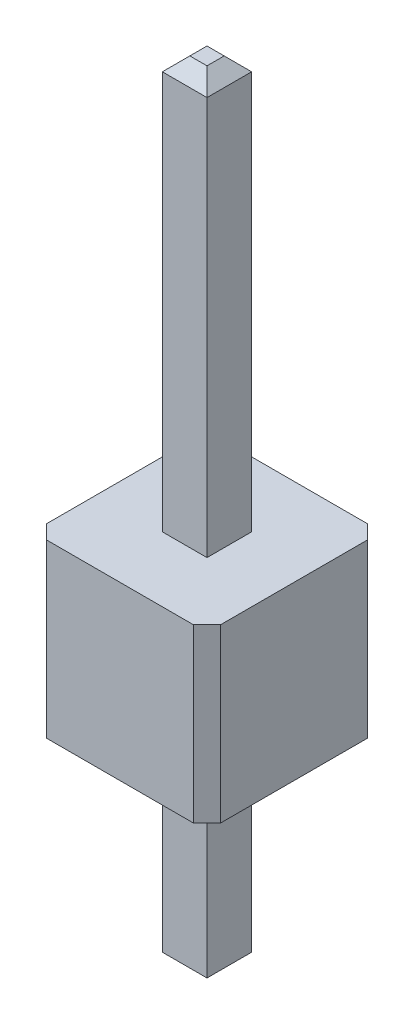
ISO-10303-21;
HEADER;
FILE_DESCRIPTION(('STEP AP214'),'2;1');
FILE_NAME('part.step','',(''),(''),'','','');
FILE_SCHEMA(('AUTOMOTIVE_DESIGN { 1 0 10303 214 1 1 1 1 }'));
ENDSEC;
DATA;
#1=APPLICATION_CONTEXT('core data for automotive mechanical design processes');
#2=APPLICATION_PROTOCOL_DEFINITION('international standard','automotive_design',2000,#1);
#3=PRODUCT_CONTEXT('',#1,'mechanical');
#4=PRODUCT('Part','Part','',(#3));
#5=PRODUCT_RELATED_PRODUCT_CATEGORY('part','',(#4));
#6=PRODUCT_DEFINITION_FORMATION('','',#4);
#7=PRODUCT_DEFINITION_CONTEXT('part definition',#1,'design');
#8=PRODUCT_DEFINITION('design','',#6,#7);
#9=PRODUCT_DEFINITION_SHAPE('','',#8);
#10=(LENGTH_UNIT() NAMED_UNIT(*) SI_UNIT(.MILLI.,.METRE.));
#11=(NAMED_UNIT(*) PLANE_ANGLE_UNIT() SI_UNIT($,.RADIAN.));
#12=(NAMED_UNIT(*) SI_UNIT($,.STERADIAN.) SOLID_ANGLE_UNIT());
#13=UNCERTAINTY_MEASURE_WITH_UNIT(LENGTH_MEASURE(1.E-05),#10,'distance_accuracy_value','');
#14=(GEOMETRIC_REPRESENTATION_CONTEXT(3) GLOBAL_UNCERTAINTY_ASSIGNED_CONTEXT((#13)) GLOBAL_UNIT_ASSIGNED_CONTEXT((#10,
#11,#12)) REPRESENTATION_CONTEXT('',''));
#15=CARTESIAN_POINT('',(0.,0.,0.));
#16=DIRECTION('',(0.,0.,1.));
#17=DIRECTION('',(1.,0.,0.));
#18=AXIS2_PLACEMENT_3D('',#15,#16,#17);
#19=CARTESIAN_POINT('',(1.27,2.5,1.27));
#20=DIRECTION('',(-1.,0.,0.));
#21=DIRECTION('',(0.,0.,1.));
#22=AXIS2_PLACEMENT_3D('',#19,#20,#21);
#23=PLANE('',#22);
#24=DIRECTION('',(0.,0.,-1.));
#25=VECTOR('',#24,1.);
#26=CARTESIAN_POINT('',(1.27,0.,1.27));
#27=LINE('',#26,#25);
#28=CARTESIAN_POINT('',(1.27,0.,1.07));
#29=VERTEX_POINT('',#28);
#30=CARTESIAN_POINT('',(1.27,0.,-1.07));
#31=VERTEX_POINT('',#30);
#32=EDGE_CURVE('E208',#29,#31,#27,.T.);
#33=ORIENTED_EDGE('',*,*,#32,.T.);
#34=DIRECTION('',(0.,1.,0.));
#35=VECTOR('',#34,1.);
#36=CARTESIAN_POINT('',(1.27,2.5,-1.07));
#37=LINE('',#36,#35);
#38=CARTESIAN_POINT('',(1.27,2.5,-1.07));
#39=VERTEX_POINT('',#38);
#40=EDGE_CURVE('E298',#31,#39,#37,.T.);
#41=ORIENTED_EDGE('',*,*,#40,.T.);
#42=DIRECTION('',(0.,0.,-1.));
#43=VECTOR('',#42,1.);
#44=CARTESIAN_POINT('',(1.27,2.5,1.27));
#45=LINE('',#44,#43);
#46=CARTESIAN_POINT('',(1.27,2.5,1.07));
#47=VERTEX_POINT('',#46);
#48=EDGE_CURVE('E209',#47,#39,#45,.T.);
#49=ORIENTED_EDGE('',*,*,#48,.F.);
#50=DIRECTION('',(0.,-1.,0.));
#51=VECTOR('',#50,1.);
#52=CARTESIAN_POINT('',(1.27,2.5,1.07));
#53=LINE('',#52,#51);
#54=EDGE_CURVE('E294',#47,#29,#53,.T.);
#55=ORIENTED_EDGE('',*,*,#54,.T.);
#56=EDGE_LOOP('',(#33,#41,#49,#55));
#57=FACE_BOUND('',#56,.T.);
#58=ADVANCED_FACE('F39',(#57),#23,.F.);
#59=CARTESIAN_POINT('',(-1.27,2.5,-1.27));
#60=DIRECTION('',(0.,0.,1.));
#61=DIRECTION('',(1.,0.,0.));
#62=AXIS2_PLACEMENT_3D('',#59,#60,#61);
#63=PLANE('',#62);
#64=DIRECTION('',(-1.,0.,0.));
#65=VECTOR('',#64,1.);
#66=CARTESIAN_POINT('',(-1.27,0.,-1.27));
#67=LINE('',#66,#65);
#68=CARTESIAN_POINT('',(1.07,0.,-1.27));
#69=VERTEX_POINT('',#68);
#70=CARTESIAN_POINT('',(-1.07,0.,-1.27));
#71=VERTEX_POINT('',#70);
#72=EDGE_CURVE('E230',#69,#71,#67,.T.);
#73=ORIENTED_EDGE('',*,*,#72,.T.);
#74=DIRECTION('',(0.,1.,0.));
#75=VECTOR('',#74,1.);
#76=CARTESIAN_POINT('',(-1.07,2.5,-1.27));
#77=LINE('',#76,#75);
#78=CARTESIAN_POINT('',(-1.07,2.5,-1.27));
#79=VERTEX_POINT('',#78);
#80=EDGE_CURVE('E279',#71,#79,#77,.T.);
#81=ORIENTED_EDGE('',*,*,#80,.T.);
#82=DIRECTION('',(-1.,0.,0.));
#83=VECTOR('',#82,1.);
#84=CARTESIAN_POINT('',(-1.27,2.5,-1.27));
#85=LINE('',#84,#83);
#86=CARTESIAN_POINT('',(1.07,2.5,-1.27));
#87=VERTEX_POINT('',#86);
#88=EDGE_CURVE('E213',#87,#79,#85,.T.);
#89=ORIENTED_EDGE('',*,*,#88,.F.);
#90=DIRECTION('',(0.,-1.,0.));
#91=VECTOR('',#90,1.);
#92=CARTESIAN_POINT('',(1.07,2.5,-1.27));
#93=LINE('',#92,#91);
#94=EDGE_CURVE('E275',#87,#69,#93,.T.);
#95=ORIENTED_EDGE('',*,*,#94,.T.);
#96=EDGE_LOOP('',(#73,#81,#89,#95));
#97=FACE_BOUND('',#96,.T.);
#98=ADVANCED_FACE('F422',(#97),#63,.F.);
#99=CARTESIAN_POINT('',(-1.27,2.5,1.27));
#100=DIRECTION('',(1.,0.,0.));
#101=DIRECTION('',(0.,0.,-1.));
#102=AXIS2_PLACEMENT_3D('',#99,#100,#101);
#103=PLANE('',#102);
#104=DIRECTION('',(0.,0.,1.));
#105=VECTOR('',#104,1.);
#106=CARTESIAN_POINT('',(-1.27,2.5,1.27));
#107=LINE('',#106,#105);
#108=CARTESIAN_POINT('',(-1.27,2.5,-1.07));
#109=VERTEX_POINT('',#108);
#110=CARTESIAN_POINT('',(-1.27,2.5,1.07));
#111=VERTEX_POINT('',#110);
#112=EDGE_CURVE('E218',#109,#111,#107,.T.);
#113=ORIENTED_EDGE('',*,*,#112,.F.);
#114=DIRECTION('',(0.,-1.,0.));
#115=VECTOR('',#114,1.);
#116=CARTESIAN_POINT('',(-1.27,2.5,-1.07));
#117=LINE('',#116,#115);
#118=CARTESIAN_POINT('',(-1.27,0.,-1.07));
#119=VERTEX_POINT('',#118);
#120=EDGE_CURVE('E259',#109,#119,#117,.T.);
#121=ORIENTED_EDGE('',*,*,#120,.T.);
#122=DIRECTION('',(0.,0.,1.));
#123=VECTOR('',#122,1.);
#124=CARTESIAN_POINT('',(-1.27,0.,1.27));
#125=LINE('',#124,#123);
#126=CARTESIAN_POINT('',(-1.27,0.,1.07));
#127=VERTEX_POINT('',#126);
#128=EDGE_CURVE('E234',#119,#127,#125,.T.);
#129=ORIENTED_EDGE('',*,*,#128,.T.);
#130=DIRECTION('',(0.,1.,0.));
#131=VECTOR('',#130,1.);
#132=CARTESIAN_POINT('',(-1.27,2.5,1.07));
#133=LINE('',#132,#131);
#134=EDGE_CURVE('E256',#127,#111,#133,.T.);
#135=ORIENTED_EDGE('',*,*,#134,.T.);
#136=EDGE_LOOP('',(#113,#121,#129,#135));
#137=FACE_BOUND('',#136,.T.);
#138=ADVANCED_FACE('F428',(#137),#103,.F.);
#139=CARTESIAN_POINT('',(-1.27,2.5,1.27));
#140=DIRECTION('',(0.,0.,-1.));
#141=DIRECTION('',(-1.,0.,0.));
#142=AXIS2_PLACEMENT_3D('',#139,#140,#141);
#143=PLANE('',#142);
#144=DIRECTION('',(1.,0.,0.));
#145=VECTOR('',#144,1.);
#146=CARTESIAN_POINT('',(-1.27,2.5,1.27));
#147=LINE('',#146,#145);
#148=CARTESIAN_POINT('',(-1.07,2.5,1.27));
#149=VERTEX_POINT('',#148);
#150=CARTESIAN_POINT('',(1.07,2.5,1.27));
#151=VERTEX_POINT('',#150);
#152=EDGE_CURVE('E222',#149,#151,#147,.T.);
#153=ORIENTED_EDGE('',*,*,#152,.F.);
#154=DIRECTION('',(0.,-1.,0.));
#155=VECTOR('',#154,1.);
#156=CARTESIAN_POINT('',(-1.07,2.5,1.27));
#157=LINE('',#156,#155);
#158=CARTESIAN_POINT('',(-1.07,0.,1.27));
#159=VERTEX_POINT('',#158);
#160=EDGE_CURVE('E304',#149,#159,#157,.T.);
#161=ORIENTED_EDGE('',*,*,#160,.T.);
#162=DIRECTION('',(1.,0.,0.));
#163=VECTOR('',#162,1.);
#164=CARTESIAN_POINT('',(-1.27,0.,1.27));
#165=LINE('',#164,#163);
#166=CARTESIAN_POINT('',(1.07,0.,1.27));
#167=VERTEX_POINT('',#166);
#168=EDGE_CURVE('E214',#159,#167,#165,.T.);
#169=ORIENTED_EDGE('',*,*,#168,.T.);
#170=DIRECTION('',(0.,1.,0.));
#171=VECTOR('',#170,1.);
#172=CARTESIAN_POINT('',(1.07,2.5,1.27));
#173=LINE('',#172,#171);
#174=EDGE_CURVE('E301',#167,#151,#173,.T.);
#175=ORIENTED_EDGE('',*,*,#174,.T.);
#176=EDGE_LOOP('',(#153,#161,#169,#175));
#177=FACE_BOUND('',#176,.T.);
#178=ADVANCED_FACE('F525',(#177),#143,.F.);
#179=CARTESIAN_POINT('',(0.,2.5,0.));
#180=DIRECTION('',(0.,-1.,0.));
#181=DIRECTION('',(0.,0.,-1.));
#182=AXIS2_PLACEMENT_3D('',#179,#180,#181);
#183=PLANE('',#182);
#184=DIRECTION('',(1.,0.,0.));
#185=VECTOR('',#184,1.);
#186=CARTESIAN_POINT('',(0.,2.5,-0.325));
#187=LINE('',#186,#185);
#188=CARTESIAN_POINT('',(-0.325,2.5,-0.325));
#189=VERTEX_POINT('',#188);
#190=CARTESIAN_POINT('',(0.325,2.5,-0.325));
#191=VERTEX_POINT('',#190);
#192=EDGE_CURVE('E177',#189,#191,#187,.T.);
#193=ORIENTED_EDGE('',*,*,#192,.T.);
#194=DIRECTION('',(0.,0.,1.));
#195=VECTOR('',#194,1.);
#196=CARTESIAN_POINT('',(0.325,2.5,0.));
#197=LINE('',#196,#195);
#198=CARTESIAN_POINT('',(0.325,2.5,0.325));
#199=VERTEX_POINT('',#198);
#200=EDGE_CURVE('E202',#191,#199,#197,.T.);
#201=ORIENTED_EDGE('',*,*,#200,.T.);
#202=DIRECTION('',(-1.,0.,0.));
#203=VECTOR('',#202,1.);
#204=CARTESIAN_POINT('',(0.,2.5,0.325));
#205=LINE('',#204,#203);
#206=CARTESIAN_POINT('',(-0.325,2.5,0.325));
#207=VERTEX_POINT('',#206);
#208=EDGE_CURVE('E198',#199,#207,#205,.T.);
#209=ORIENTED_EDGE('',*,*,#208,.T.);
#210=DIRECTION('',(0.,0.,-1.));
#211=VECTOR('',#210,1.);
#212=CARTESIAN_POINT('',(-0.325,2.5,0.));
#213=LINE('',#212,#211);
#214=EDGE_CURVE('E186',#207,#189,#213,.T.);
#215=ORIENTED_EDGE('',*,*,#214,.T.);
#216=EDGE_LOOP('',(#193,#201,#209,#215));
#217=FACE_BOUND('',#216,.T.);
#218=ORIENTED_EDGE('',*,*,#88,.T.);
#219=DIRECTION('',(0.707106781186548,0.,-0.707106781186548));
#220=VECTOR('',#219,1.);
#221=CARTESIAN_POINT('',(-1.27,2.5,-1.07));
#222=LINE('',#221,#220);
#223=EDGE_CURVE('E291',#79,#109,#222,.F.);
#224=ORIENTED_EDGE('',*,*,#223,.T.);
#225=ORIENTED_EDGE('',*,*,#112,.T.);
#226=DIRECTION('',(-0.707106781186548,0.,-0.707106781186548));
#227=VECTOR('',#226,1.);
#228=CARTESIAN_POINT('',(-1.07,2.5,1.27));
#229=LINE('',#228,#227);
#230=EDGE_CURVE('E285',#111,#149,#229,.F.);
#231=ORIENTED_EDGE('',*,*,#230,.T.);
#232=ORIENTED_EDGE('',*,*,#152,.T.);
#233=DIRECTION('',(-0.707106781186548,0.,0.707106781186548));
#234=VECTOR('',#233,1.);
#235=CARTESIAN_POINT('',(1.27,2.5,1.07));
#236=LINE('',#235,#234);
#237=EDGE_CURVE('E282',#151,#47,#236,.F.);
#238=ORIENTED_EDGE('',*,*,#237,.T.);
#239=ORIENTED_EDGE('',*,*,#48,.T.);
#240=DIRECTION('',(0.707106781186544,0.,0.707106781186551));
#241=VECTOR('',#240,1.);
#242=CARTESIAN_POINT('',(1.07,2.5,-1.27));
#243=LINE('',#242,#241);
#244=EDGE_CURVE('E288',#39,#87,#243,.F.);
#245=ORIENTED_EDGE('',*,*,#244,.T.);
#246=EDGE_LOOP('',(#218,#224,#225,#231,#232,#238,#239,#245));
#247=FACE_BOUND('',#246,.T.);
#248=ADVANCED_FACE('F196',(#217,#247),#183,.F.);
#249=CARTESIAN_POINT('',(0.,0.,0.));
#250=DIRECTION('',(0.,-1.,0.));
#251=DIRECTION('',(0.,0.,-1.));
#252=AXIS2_PLACEMENT_3D('',#249,#250,#251);
#253=PLANE('',#252);
#254=DIRECTION('',(0.,0.,1.));
#255=VECTOR('',#254,1.);
#256=CARTESIAN_POINT('',(0.325,0.,0.));
#257=LINE('',#256,#255);
#258=CARTESIAN_POINT('',(0.325,0.,-0.325));
#259=VERTEX_POINT('',#258);
#260=CARTESIAN_POINT('',(0.325,0.,0.325));
#261=VERTEX_POINT('',#260);
#262=EDGE_CURVE('E252',#259,#261,#257,.T.);
#263=ORIENTED_EDGE('',*,*,#262,.F.);
#264=DIRECTION('',(1.,0.,0.));
#265=VECTOR('',#264,1.);
#266=CARTESIAN_POINT('',(0.,0.,-0.325));
#267=LINE('',#266,#265);
#268=CARTESIAN_POINT('',(-0.325,0.,-0.325));
#269=VERTEX_POINT('',#268);
#270=EDGE_CURVE('E226',#269,#259,#267,.T.);
#271=ORIENTED_EDGE('',*,*,#270,.F.);
#272=DIRECTION('',(0.,0.,-1.));
#273=VECTOR('',#272,1.);
#274=CARTESIAN_POINT('',(-0.325,0.,0.));
#275=LINE('',#274,#273);
#276=CARTESIAN_POINT('',(-0.325,0.,0.325));
#277=VERTEX_POINT('',#276);
#278=EDGE_CURVE('E244',#277,#269,#275,.T.);
#279=ORIENTED_EDGE('',*,*,#278,.F.);
#280=DIRECTION('',(-1.,0.,0.));
#281=VECTOR('',#280,1.);
#282=CARTESIAN_POINT('',(0.,0.,0.325));
#283=LINE('',#282,#281);
#284=EDGE_CURVE('E248',#261,#277,#283,.T.);
#285=ORIENTED_EDGE('',*,*,#284,.F.);
#286=EDGE_LOOP('',(#263,#271,#279,#285));
#287=FACE_BOUND('',#286,.T.);
#288=ORIENTED_EDGE('',*,*,#128,.F.);
#289=DIRECTION('',(-0.707106781186548,0.,0.707106781186548));
#290=VECTOR('',#289,1.);
#291=CARTESIAN_POINT('',(-1.17,0.,-1.17));
#292=LINE('',#291,#290);
#293=EDGE_CURVE('E272',#119,#71,#292,.F.);
#294=ORIENTED_EDGE('',*,*,#293,.T.);
#295=ORIENTED_EDGE('',*,*,#72,.F.);
#296=DIRECTION('',(-0.707106781186544,0.,-0.707106781186551));
#297=VECTOR('',#296,1.);
#298=CARTESIAN_POINT('',(1.17,0.,-1.16999999999999));
#299=LINE('',#298,#297);
#300=EDGE_CURVE('E269',#69,#31,#299,.F.);
#301=ORIENTED_EDGE('',*,*,#300,.T.);
#302=ORIENTED_EDGE('',*,*,#32,.F.);
#303=DIRECTION('',(0.707106781186548,0.,-0.707106781186548));
#304=VECTOR('',#303,1.);
#305=CARTESIAN_POINT('',(1.17,0.,1.17));
#306=LINE('',#305,#304);
#307=EDGE_CURVE('E263',#29,#167,#306,.F.);
#308=ORIENTED_EDGE('',*,*,#307,.T.);
#309=ORIENTED_EDGE('',*,*,#168,.F.);
#310=DIRECTION('',(0.707106781186548,0.,0.707106781186548));
#311=VECTOR('',#310,1.);
#312=CARTESIAN_POINT('',(-1.17,0.,1.17));
#313=LINE('',#312,#311);
#314=EDGE_CURVE('E266',#159,#127,#313,.F.);
#315=ORIENTED_EDGE('',*,*,#314,.T.);
#316=EDGE_LOOP('',(#288,#294,#295,#301,#302,#308,#309,#315));
#317=FACE_BOUND('',#316,.T.);
#318=ADVANCED_FACE('F508',(#287,#317),#253,.T.);
#319=CARTESIAN_POINT('',(0.,-3.,0.));
#320=DIRECTION('',(0.,-1.,0.));
#321=DIRECTION('',(0.,0.,-1.));
#322=AXIS2_PLACEMENT_3D('',#319,#320,#321);
#323=PLANE('',#322);
#324=DIRECTION('',(0.,0.,1.));
#325=VECTOR('',#324,1.);
#326=CARTESIAN_POINT('',(0.125,-3.,0.));
#327=LINE('',#326,#325);
#328=CARTESIAN_POINT('',(0.125,-3.,-0.125));
#329=VERTEX_POINT('',#328);
#330=CARTESIAN_POINT('',(0.125,-3.,0.124999999999999));
#331=VERTEX_POINT('',#330);
#332=EDGE_CURVE('E312',#329,#331,#327,.T.);
#333=ORIENTED_EDGE('',*,*,#332,.T.);
#334=DIRECTION('',(-1.,0.,0.));
#335=VECTOR('',#334,1.);
#336=CARTESIAN_POINT('',(0.,-3.,0.124999999999999));
#337=LINE('',#336,#335);
#338=CARTESIAN_POINT('',(-0.124999999999999,-3.,0.124999999999999));
#339=VERTEX_POINT('',#338);
#340=EDGE_CURVE('E321',#331,#339,#337,.T.);
#341=ORIENTED_EDGE('',*,*,#340,.T.);
#342=DIRECTION('',(0.,0.,-1.));
#343=VECTOR('',#342,1.);
#344=CARTESIAN_POINT('',(-0.124999999999999,-3.,0.));
#345=LINE('',#344,#343);
#346=CARTESIAN_POINT('',(-0.124999999999999,-3.,-0.125));
#347=VERTEX_POINT('',#346);
#348=EDGE_CURVE('E318',#339,#347,#345,.T.);
#349=ORIENTED_EDGE('',*,*,#348,.T.);
#350=DIRECTION('',(1.,0.,0.));
#351=VECTOR('',#350,1.);
#352=CARTESIAN_POINT('',(0.,-3.,-0.125));
#353=LINE('',#352,#351);
#354=EDGE_CURVE('E315',#347,#329,#353,.T.);
#355=ORIENTED_EDGE('',*,*,#354,.T.);
#356=EDGE_LOOP('',(#333,#341,#349,#355));
#357=FACE_BOUND('',#356,.T.);
#358=ADVANCED_FACE('F513',(#357),#323,.T.);
#359=CARTESIAN_POINT('',(-0.325,-3.,-0.325));
#360=DIRECTION('',(0.,0.,-1.));
#361=DIRECTION('',(-1.,0.,0.));
#362=AXIS2_PLACEMENT_3D('',#359,#360,#361);
#363=PLANE('',#362);
#364=DIRECTION('',(0.,1.,0.));
#365=VECTOR('',#364,1.);
#366=CARTESIAN_POINT('',(0.325,-3.,-0.325));
#367=LINE('',#366,#365);
#368=CARTESIAN_POINT('',(0.325,-2.8,-0.325));
#369=VERTEX_POINT('',#368);
#370=EDGE_CURVE('E193',#369,#259,#367,.T.);
#371=ORIENTED_EDGE('',*,*,#370,.F.);
#372=DIRECTION('',(-1.,0.,0.));
#373=VECTOR('',#372,1.);
#374=CARTESIAN_POINT('',(-0.325,-2.8,-0.325));
#375=LINE('',#374,#373);
#376=CARTESIAN_POINT('',(-0.325,-2.8,-0.325));
#377=VERTEX_POINT('',#376);
#378=EDGE_CURVE('E328',#369,#377,#375,.T.);
#379=ORIENTED_EDGE('',*,*,#378,.T.);
#380=DIRECTION('',(0.,1.,0.));
#381=VECTOR('',#380,1.);
#382=CARTESIAN_POINT('',(-0.325,-3.,-0.325));
#383=LINE('',#382,#381);
#384=EDGE_CURVE('E192',#377,#269,#383,.T.);
#385=ORIENTED_EDGE('',*,*,#384,.T.);
#386=ORIENTED_EDGE('',*,*,#270,.T.);
#387=EDGE_LOOP('',(#371,#379,#385,#386));
#388=FACE_BOUND('',#387,.T.);
#389=ADVANCED_FACE('F419',(#388),#363,.T.);
#390=CARTESIAN_POINT('',(-0.325,-3.,0.325));
#391=DIRECTION('',(-1.,0.,0.));
#392=DIRECTION('',(0.,0.,1.));
#393=AXIS2_PLACEMENT_3D('',#390,#391,#392);
#394=PLANE('',#393);
#395=ORIENTED_EDGE('',*,*,#384,.F.);
#396=DIRECTION('',(0.,0.,1.));
#397=VECTOR('',#396,1.);
#398=CARTESIAN_POINT('',(-0.325,-2.8,0.325));
#399=LINE('',#398,#397);
#400=CARTESIAN_POINT('',(-0.325,-2.8,0.325));
#401=VERTEX_POINT('',#400);
#402=EDGE_CURVE('E325',#377,#401,#399,.T.);
#403=ORIENTED_EDGE('',*,*,#402,.T.);
#404=DIRECTION('',(0.,1.,0.));
#405=VECTOR('',#404,1.);
#406=CARTESIAN_POINT('',(-0.325,-3.,0.325));
#407=LINE('',#406,#405);
#408=EDGE_CURVE('E401',#401,#277,#407,.T.);
#409=ORIENTED_EDGE('',*,*,#408,.T.);
#410=ORIENTED_EDGE('',*,*,#278,.T.);
#411=EDGE_LOOP('',(#395,#403,#409,#410));
#412=FACE_BOUND('',#411,.T.);
#413=ADVANCED_FACE('F564',(#412),#394,.T.);
#414=CARTESIAN_POINT('',(-0.325,-3.,0.325));
#415=DIRECTION('',(0.,0.,1.));
#416=DIRECTION('',(1.,0.,0.));
#417=AXIS2_PLACEMENT_3D('',#414,#415,#416);
#418=PLANE('',#417);
#419=ORIENTED_EDGE('',*,*,#408,.F.);
#420=DIRECTION('',(1.,0.,0.));
#421=VECTOR('',#420,1.);
#422=CARTESIAN_POINT('',(-0.325,-2.8,0.325));
#423=LINE('',#422,#421);
#424=CARTESIAN_POINT('',(0.325,-2.8,0.325));
#425=VERTEX_POINT('',#424);
#426=EDGE_CURVE('E308',#401,#425,#423,.T.);
#427=ORIENTED_EDGE('',*,*,#426,.T.);
#428=DIRECTION('',(0.,1.,0.));
#429=VECTOR('',#428,1.);
#430=CARTESIAN_POINT('',(0.325,-3.,0.325));
#431=LINE('',#430,#429);
#432=EDGE_CURVE('E187',#425,#261,#431,.T.);
#433=ORIENTED_EDGE('',*,*,#432,.T.);
#434=ORIENTED_EDGE('',*,*,#284,.T.);
#435=EDGE_LOOP('',(#419,#427,#433,#434));
#436=FACE_BOUND('',#435,.T.);
#437=ADVANCED_FACE('F560',(#436),#418,.T.);
#438=CARTESIAN_POINT('',(0.325,-3.,0.325));
#439=DIRECTION('',(1.,0.,0.));
#440=DIRECTION('',(0.,0.,-1.));
#441=AXIS2_PLACEMENT_3D('',#438,#439,#440);
#442=PLANE('',#441);
#443=ORIENTED_EDGE('',*,*,#432,.F.);
#444=DIRECTION('',(0.,0.,-1.));
#445=VECTOR('',#444,1.);
#446=CARTESIAN_POINT('',(0.325,-2.8,0.325));
#447=LINE('',#446,#445);
#448=EDGE_CURVE('E331',#425,#369,#447,.T.);
#449=ORIENTED_EDGE('',*,*,#448,.T.);
#450=ORIENTED_EDGE('',*,*,#370,.T.);
#451=ORIENTED_EDGE('',*,*,#262,.T.);
#452=EDGE_LOOP('',(#443,#449,#450,#451));
#453=FACE_BOUND('',#452,.T.);
#454=ADVANCED_FACE('F558',(#453),#442,.T.);
#455=CARTESIAN_POINT('',(0.325,8.3,-0.325));
#456=VERTEX_POINT('',#455);
#457=EDGE_CURVE('E180',#191,#456,#367,.T.);
#458=ORIENTED_EDGE('',*,*,#457,.T.);
#459=DIRECTION('',(0.,0.,1.));
#460=VECTOR('',#459,1.);
#461=CARTESIAN_POINT('',(0.325,8.3,0.325));
#462=LINE('',#461,#460);
#463=CARTESIAN_POINT('',(0.325,8.3,0.325));
#464=VERTEX_POINT('',#463);
#465=EDGE_CURVE('E11',#456,#464,#462,.T.);
#466=ORIENTED_EDGE('',*,*,#465,.T.);
#467=EDGE_CURVE('E396',#199,#464,#431,.T.);
#468=ORIENTED_EDGE('',*,*,#467,.F.);
#469=ORIENTED_EDGE('',*,*,#200,.F.);
#470=EDGE_LOOP('',(#458,#466,#468,#469));
#471=FACE_BOUND('',#470,.T.);
#472=ADVANCED_FACE('F395',(#471),#442,.T.);
#473=ORIENTED_EDGE('',*,*,#467,.T.);
#474=DIRECTION('',(-1.,0.,0.));
#475=VECTOR('',#474,1.);
#476=CARTESIAN_POINT('',(-0.325,8.3,0.325));
#477=LINE('',#476,#475);
#478=CARTESIAN_POINT('',(-0.325,8.3,0.325));
#479=VERTEX_POINT('',#478);
#480=EDGE_CURVE('E347',#464,#479,#477,.T.);
#481=ORIENTED_EDGE('',*,*,#480,.T.);
#482=EDGE_CURVE('E590',#207,#479,#407,.T.);
#483=ORIENTED_EDGE('',*,*,#482,.F.);
#484=ORIENTED_EDGE('',*,*,#208,.F.);
#485=EDGE_LOOP('',(#473,#481,#483,#484));
#486=FACE_BOUND('',#485,.T.);
#487=ADVANCED_FACE('F399',(#486),#418,.T.);
#488=ORIENTED_EDGE('',*,*,#482,.T.);
#489=DIRECTION('',(0.,0.,-1.));
#490=VECTOR('',#489,1.);
#491=CARTESIAN_POINT('',(-0.325,8.3,-0.325));
#492=LINE('',#491,#490);
#493=CARTESIAN_POINT('',(-0.325,8.3,-0.325));
#494=VERTEX_POINT('',#493);
#495=EDGE_CURVE('E64',#479,#494,#492,.T.);
#496=ORIENTED_EDGE('',*,*,#495,.T.);
#497=EDGE_CURVE('E179',#189,#494,#383,.T.);
#498=ORIENTED_EDGE('',*,*,#497,.F.);
#499=ORIENTED_EDGE('',*,*,#214,.F.);
#500=EDGE_LOOP('',(#488,#496,#498,#499));
#501=FACE_BOUND('',#500,.T.);
#502=ADVANCED_FACE('F189',(#501),#394,.T.);
#503=ORIENTED_EDGE('',*,*,#497,.T.);
#504=DIRECTION('',(1.,0.,0.));
#505=VECTOR('',#504,1.);
#506=CARTESIAN_POINT('',(0.325,8.3,-0.325));
#507=LINE('',#506,#505);
#508=EDGE_CURVE('E49',#494,#456,#507,.T.);
#509=ORIENTED_EDGE('',*,*,#508,.T.);
#510=ORIENTED_EDGE('',*,*,#457,.F.);
#511=ORIENTED_EDGE('',*,*,#192,.F.);
#512=EDGE_LOOP('',(#503,#509,#510,#511));
#513=FACE_BOUND('',#512,.T.);
#514=ADVANCED_FACE('F178',(#513),#363,.T.);
#515=CARTESIAN_POINT('',(0.,8.5,0.));
#516=DIRECTION('',(0.,-1.,0.));
#517=DIRECTION('',(0.,0.,-1.));
#518=AXIS2_PLACEMENT_3D('',#515,#516,#517);
#519=PLANE('',#518);
#520=DIRECTION('',(0.,0.,1.));
#521=VECTOR('',#520,1.);
#522=CARTESIAN_POINT('',(-0.124999999999998,8.5,0.325));
#523=LINE('',#522,#521);
#524=CARTESIAN_POINT('',(-0.124999999999998,8.5,-0.124999999999998));
#525=VERTEX_POINT('',#524);
#526=CARTESIAN_POINT('',(-0.124999999999998,8.5,0.124999999999998));
#527=VERTEX_POINT('',#526);
#528=EDGE_CURVE('E340',#525,#527,#523,.T.);
#529=ORIENTED_EDGE('',*,*,#528,.T.);
#530=DIRECTION('',(1.,0.,0.));
#531=VECTOR('',#530,1.);
#532=CARTESIAN_POINT('',(0.325,8.5,0.124999999999998));
#533=LINE('',#532,#531);
#534=CARTESIAN_POINT('',(0.124999999999998,8.5,0.124999999999998));
#535=VERTEX_POINT('',#534);
#536=EDGE_CURVE('E343',#527,#535,#533,.T.);
#537=ORIENTED_EDGE('',*,*,#536,.T.);
#538=DIRECTION('',(0.,0.,-1.));
#539=VECTOR('',#538,1.);
#540=CARTESIAN_POINT('',(0.124999999999998,8.5,-0.325));
#541=LINE('',#540,#539);
#542=CARTESIAN_POINT('',(0.124999999999998,8.5,-0.124999999999998));
#543=VERTEX_POINT('',#542);
#544=EDGE_CURVE('E334',#535,#543,#541,.T.);
#545=ORIENTED_EDGE('',*,*,#544,.T.);
#546=DIRECTION('',(-1.,0.,0.));
#547=VECTOR('',#546,1.);
#548=CARTESIAN_POINT('',(-0.325,8.5,-0.124999999999998));
#549=LINE('',#548,#547);
#550=EDGE_CURVE('E337',#543,#525,#549,.T.);
#551=ORIENTED_EDGE('',*,*,#550,.T.);
#552=EDGE_LOOP('',(#529,#537,#545,#551));
#553=FACE_BOUND('',#552,.T.);
#554=ADVANCED_FACE('F407',(#553),#519,.F.);
#555=CARTESIAN_POINT('',(-1.27,2.5,-1.07));
#556=DIRECTION('',(0.707106781186547,0.,0.707106781186547));
#557=DIRECTION('',(0.,-1.,0.));
#558=AXIS2_PLACEMENT_3D('',#555,#556,#557);
#559=PLANE('',#558);
#560=ORIENTED_EDGE('',*,*,#223,.F.);
#561=ORIENTED_EDGE('',*,*,#80,.F.);
#562=ORIENTED_EDGE('',*,*,#293,.F.);
#563=ORIENTED_EDGE('',*,*,#120,.F.);
#564=EDGE_LOOP('',(#560,#561,#562,#563));
#565=FACE_BOUND('',#564,.T.);
#566=ADVANCED_FACE('F409',(#565),#559,.F.);
#567=CARTESIAN_POINT('',(1.07,2.5,-1.27));
#568=DIRECTION('',(-0.707106781186551,0.,0.707106781186544));
#569=DIRECTION('',(0.,-1.,0.));
#570=AXIS2_PLACEMENT_3D('',#567,#568,#569);
#571=PLANE('',#570);
#572=ORIENTED_EDGE('',*,*,#244,.F.);
#573=ORIENTED_EDGE('',*,*,#40,.F.);
#574=ORIENTED_EDGE('',*,*,#300,.F.);
#575=ORIENTED_EDGE('',*,*,#94,.F.);
#576=EDGE_LOOP('',(#572,#573,#574,#575));
#577=FACE_BOUND('',#576,.T.);
#578=ADVANCED_FACE('F415',(#577),#571,.F.);
#579=CARTESIAN_POINT('',(-1.07,2.5,1.27));
#580=DIRECTION('',(0.707106781186547,0.,-0.707106781186547));
#581=DIRECTION('',(0.,-1.,0.));
#582=AXIS2_PLACEMENT_3D('',#579,#580,#581);
#583=PLANE('',#582);
#584=ORIENTED_EDGE('',*,*,#230,.F.);
#585=ORIENTED_EDGE('',*,*,#134,.F.);
#586=ORIENTED_EDGE('',*,*,#314,.F.);
#587=ORIENTED_EDGE('',*,*,#160,.F.);
#588=EDGE_LOOP('',(#584,#585,#586,#587));
#589=FACE_BOUND('',#588,.T.);
#590=ADVANCED_FACE('F435',(#589),#583,.F.);
#591=CARTESIAN_POINT('',(1.27,2.5,1.07));
#592=DIRECTION('',(-0.707106781186547,0.,-0.707106781186547));
#593=DIRECTION('',(0.,-1.,0.));
#594=AXIS2_PLACEMENT_3D('',#591,#592,#593);
#595=PLANE('',#594);
#596=ORIENTED_EDGE('',*,*,#237,.F.);
#597=ORIENTED_EDGE('',*,*,#174,.F.);
#598=ORIENTED_EDGE('',*,*,#307,.F.);
#599=ORIENTED_EDGE('',*,*,#54,.F.);
#600=EDGE_LOOP('',(#596,#597,#598,#599));
#601=FACE_BOUND('',#600,.T.);
#602=ADVANCED_FACE('F439',(#601),#595,.F.);
#603=CARTESIAN_POINT('',(-0.325,-2.8,-0.325));
#604=DIRECTION('',(0.,0.707106781186551,0.707106781186544));
#605=DIRECTION('',(-1.,0.,0.));
#606=AXIS2_PLACEMENT_3D('',#603,#604,#605);
#607=PLANE('',#606);
#608=DIRECTION('',(0.577350269189627,0.577350269189622,-0.577350269189627));
#609=VECTOR('',#608,1.);
#610=CARTESIAN_POINT('',(0.108333333333332,-3.01666666666667,-0.108333333333332));
#611=LINE('',#610,#609);
#612=EDGE_CURVE('E361',#329,#369,#611,.T.);
#613=ORIENTED_EDGE('',*,*,#612,.F.);
#614=ORIENTED_EDGE('',*,*,#354,.F.);
#615=DIRECTION('',(-0.577350269189627,0.577350269189622,-0.577350269189627));
#616=VECTOR('',#615,1.);
#617=CARTESIAN_POINT('',(-0.325,-2.8,-0.325));
#618=LINE('',#617,#616);
#619=EDGE_CURVE('E365',#377,#347,#618,.F.);
#620=ORIENTED_EDGE('',*,*,#619,.F.);
#621=ORIENTED_EDGE('',*,*,#378,.F.);
#622=EDGE_LOOP('',(#613,#614,#620,#621));
#623=FACE_BOUND('',#622,.T.);
#624=ADVANCED_FACE('F443',(#623),#607,.F.);
#625=CARTESIAN_POINT('',(-0.325,-2.8,0.325));
#626=DIRECTION('',(0.707106781186544,0.707106781186551,0.));
#627=DIRECTION('',(0.,0.,1.));
#628=AXIS2_PLACEMENT_3D('',#625,#626,#627);
#629=PLANE('',#628);
#630=ORIENTED_EDGE('',*,*,#619,.T.);
#631=ORIENTED_EDGE('',*,*,#348,.F.);
#632=DIRECTION('',(-0.577350269189627,0.577350269189622,0.577350269189627));
#633=VECTOR('',#632,1.);
#634=CARTESIAN_POINT('',(-0.325,-2.8,0.325));
#635=LINE('',#634,#633);
#636=EDGE_CURVE('E358',#401,#339,#635,.F.);
#637=ORIENTED_EDGE('',*,*,#636,.F.);
#638=ORIENTED_EDGE('',*,*,#402,.F.);
#639=EDGE_LOOP('',(#630,#631,#637,#638));
#640=FACE_BOUND('',#639,.T.);
#641=ADVANCED_FACE('F452',(#640),#629,.F.);
#642=CARTESIAN_POINT('',(0.325,-2.8,0.325));
#643=DIRECTION('',(-0.707106781186544,0.707106781186551,0.));
#644=DIRECTION('',(0.,0.,-1.));
#645=AXIS2_PLACEMENT_3D('',#642,#643,#644);
#646=PLANE('',#645);
#647=ORIENTED_EDGE('',*,*,#612,.T.);
#648=ORIENTED_EDGE('',*,*,#448,.F.);
#649=DIRECTION('',(-0.577350269189627,-0.577350269189622,-0.577350269189627));
#650=VECTOR('',#649,1.);
#651=CARTESIAN_POINT('',(0.325,-2.8,0.325));
#652=LINE('',#651,#650);
#653=EDGE_CURVE('E355',#331,#425,#652,.F.);
#654=ORIENTED_EDGE('',*,*,#653,.F.);
#655=ORIENTED_EDGE('',*,*,#332,.F.);
#656=EDGE_LOOP('',(#647,#648,#654,#655));
#657=FACE_BOUND('',#656,.T.);
#658=ADVANCED_FACE('F448',(#657),#646,.F.);
#659=CARTESIAN_POINT('',(-0.325,-2.8,0.325));
#660=DIRECTION('',(0.,0.707106781186551,-0.707106781186544));
#661=DIRECTION('',(1.,0.,0.));
#662=AXIS2_PLACEMENT_3D('',#659,#660,#661);
#663=PLANE('',#662);
#664=ORIENTED_EDGE('',*,*,#636,.T.);
#665=ORIENTED_EDGE('',*,*,#340,.F.);
#666=ORIENTED_EDGE('',*,*,#653,.T.);
#667=ORIENTED_EDGE('',*,*,#426,.F.);
#668=EDGE_LOOP('',(#664,#665,#666,#667));
#669=FACE_BOUND('',#668,.T.);
#670=ADVANCED_FACE('F445',(#669),#663,.F.);
#671=CARTESIAN_POINT('',(0.,8.5,-0.124999999999998));
#672=DIRECTION('',(0.,0.707106781186547,-0.707106781186547));
#673=DIRECTION('',(1.,0.,0.));
#674=AXIS2_PLACEMENT_3D('',#671,#672,#673);
#675=PLANE('',#674);
#676=DIRECTION('',(-0.577350269189626,0.577350269189626,0.577350269189626));
#677=VECTOR('',#676,1.);
#678=CARTESIAN_POINT('',(0.0833333333333319,8.54166666666667,-0.0833333333333319));
#679=LINE('',#678,#677);
#680=EDGE_CURVE('E374',#456,#543,#679,.T.);
#681=ORIENTED_EDGE('',*,*,#680,.F.);
#682=ORIENTED_EDGE('',*,*,#508,.F.);
#683=DIRECTION('',(0.577350269189626,0.577350269189626,0.577350269189626));
#684=VECTOR('',#683,1.);
#685=CARTESIAN_POINT('',(-0.0833333333333318,8.54166666666667,-0.083333333333332));
#686=LINE('',#685,#684);
#687=EDGE_CURVE('E43',#525,#494,#686,.F.);
#688=ORIENTED_EDGE('',*,*,#687,.F.);
#689=ORIENTED_EDGE('',*,*,#550,.F.);
#690=EDGE_LOOP('',(#681,#682,#688,#689));
#691=FACE_BOUND('',#690,.T.);
#692=ADVANCED_FACE('F41',(#691),#675,.T.);
#693=CARTESIAN_POINT('',(-0.124999999999998,8.5,0.));
#694=DIRECTION('',(-0.707106781186547,0.707106781186547,0.));
#695=DIRECTION('',(0.,0.,-1.));
#696=AXIS2_PLACEMENT_3D('',#693,#694,#695);
#697=PLANE('',#696);
#698=ORIENTED_EDGE('',*,*,#687,.T.);
#699=ORIENTED_EDGE('',*,*,#495,.F.);
#700=DIRECTION('',(0.577350269189626,0.577350269189626,-0.577350269189626));
#701=VECTOR('',#700,1.);
#702=CARTESIAN_POINT('',(-0.0833333333333317,8.54166666666667,0.0833333333333318));
#703=LINE('',#702,#701);
#704=EDGE_CURVE('E372',#527,#479,#703,.F.);
#705=ORIENTED_EDGE('',*,*,#704,.F.);
#706=ORIENTED_EDGE('',*,*,#528,.F.);
#707=EDGE_LOOP('',(#698,#699,#705,#706));
#708=FACE_BOUND('',#707,.T.);
#709=ADVANCED_FACE('F386',(#708),#697,.T.);
#710=CARTESIAN_POINT('',(0.124999999999998,8.5,0.));
#711=DIRECTION('',(0.707106781186547,0.707106781186547,0.));
#712=DIRECTION('',(0.,0.,1.));
#713=AXIS2_PLACEMENT_3D('',#710,#711,#712);
#714=PLANE('',#713);
#715=ORIENTED_EDGE('',*,*,#680,.T.);
#716=ORIENTED_EDGE('',*,*,#544,.F.);
#717=DIRECTION('',(0.577350269189626,-0.577350269189626,0.577350269189626));
#718=VECTOR('',#717,1.);
#719=CARTESIAN_POINT('',(0.083333333333332,8.54166666666667,0.0833333333333318));
#720=LINE('',#719,#718);
#721=EDGE_CURVE('E369',#464,#535,#720,.F.);
#722=ORIENTED_EDGE('',*,*,#721,.F.);
#723=ORIENTED_EDGE('',*,*,#465,.F.);
#724=EDGE_LOOP('',(#715,#716,#722,#723));
#725=FACE_BOUND('',#724,.T.);
#726=ADVANCED_FACE('F391',(#725),#714,.T.);
#727=CARTESIAN_POINT('',(0.,8.5,0.124999999999998));
#728=DIRECTION('',(0.,0.707106781186547,0.707106781186547));
#729=DIRECTION('',(-1.,0.,0.));
#730=AXIS2_PLACEMENT_3D('',#727,#728,#729);
#731=PLANE('',#730);
#732=ORIENTED_EDGE('',*,*,#704,.T.);
#733=ORIENTED_EDGE('',*,*,#480,.F.);
#734=ORIENTED_EDGE('',*,*,#721,.T.);
#735=ORIENTED_EDGE('',*,*,#536,.F.);
#736=EDGE_LOOP('',(#732,#733,#734,#735));
#737=FACE_BOUND('',#736,.T.);
#738=ADVANCED_FACE('F404',(#737),#731,.T.);
#739=CLOSED_SHELL('',(#58,#98,#138,#178,#248,#318,#358,#389,#413,#437,#454,#472,#487,#502,#514,
#554,#566,#578,#590,#602,#624,#641,#658,#670,#692,#709,#726,#738));
#740=MANIFOLD_SOLID_BREP('B2',#739);
#741=ADVANCED_BREP_SHAPE_REPRESENTATION('',(#18,#740),#14);
#742=SHAPE_DEFINITION_REPRESENTATION(#9,#741);
ENDSEC;
END-ISO-10303-21;
